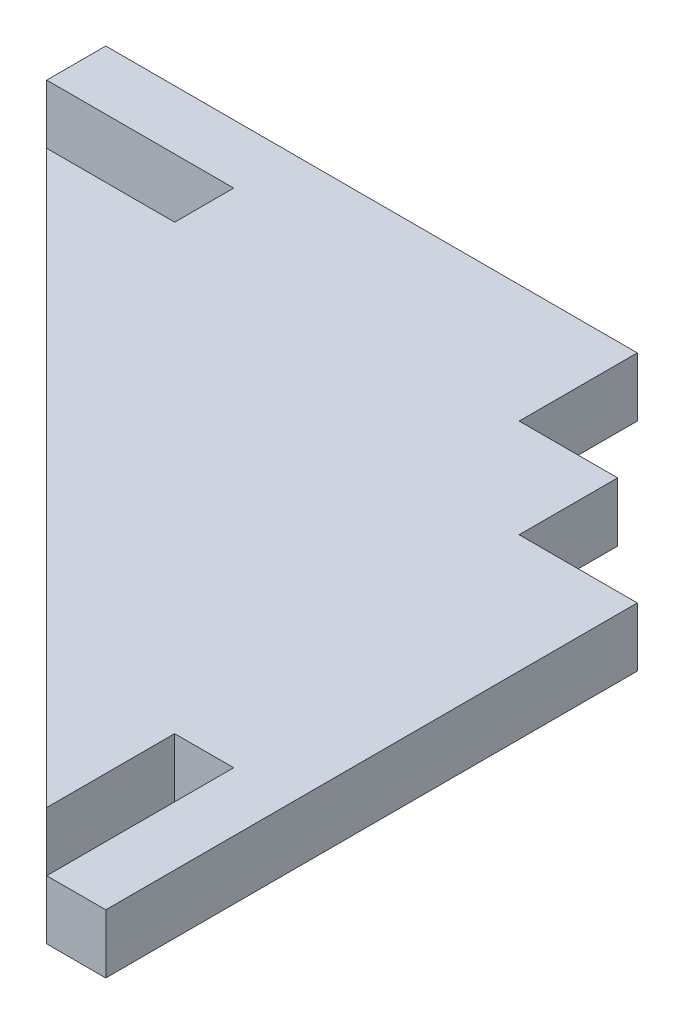
ISO-10303-21;
HEADER;
FILE_DESCRIPTION(('STEP AP214'),'2;1');
FILE_NAME('part.step','',(''),(''),'','','');
FILE_SCHEMA(('AUTOMOTIVE_DESIGN { 1 0 10303 214 1 1 1 1 }'));
ENDSEC;
DATA;
#1=APPLICATION_CONTEXT('core data for automotive mechanical design processes');
#2=APPLICATION_PROTOCOL_DEFINITION('international standard','automotive_design',2000,#1);
#3=PRODUCT_CONTEXT('',#1,'mechanical');
#4=PRODUCT('Part','Part','',(#3));
#5=PRODUCT_RELATED_PRODUCT_CATEGORY('part','',(#4));
#6=PRODUCT_DEFINITION_FORMATION('','',#4);
#7=PRODUCT_DEFINITION_CONTEXT('part definition',#1,'design');
#8=PRODUCT_DEFINITION('design','',#6,#7);
#9=PRODUCT_DEFINITION_SHAPE('','',#8);
#10=(LENGTH_UNIT() NAMED_UNIT(*) SI_UNIT(.MILLI.,.METRE.));
#11=(NAMED_UNIT(*) PLANE_ANGLE_UNIT() SI_UNIT($,.RADIAN.));
#12=(NAMED_UNIT(*) SI_UNIT($,.STERADIAN.) SOLID_ANGLE_UNIT());
#13=UNCERTAINTY_MEASURE_WITH_UNIT(LENGTH_MEASURE(1.E-05),#10,'distance_accuracy_value','');
#14=(GEOMETRIC_REPRESENTATION_CONTEXT(3) GLOBAL_UNCERTAINTY_ASSIGNED_CONTEXT((#13)) GLOBAL_UNIT_ASSIGNED_CONTEXT((#10,
#11,#12)) REPRESENTATION_CONTEXT('',''));
#15=CARTESIAN_POINT('',(0.,0.,0.));
#16=DIRECTION('',(0.,0.,1.));
#17=DIRECTION('',(1.,0.,0.));
#18=AXIS2_PLACEMENT_3D('',#15,#16,#17);
#19=CARTESIAN_POINT('',(0.,6.,10.));
#20=DIRECTION('',(-1.,0.,0.));
#21=DIRECTION('',(0.,0.,1.));
#22=AXIS2_PLACEMENT_3D('',#19,#20,#21);
#23=PLANE('',#22);
#24=DIRECTION('',(0.,0.,-1.));
#25=VECTOR('',#24,1.);
#26=CARTESIAN_POINT('',(0.,0.,10.));
#27=LINE('',#26,#25);
#28=CARTESIAN_POINT('',(0.,0.,10.));
#29=VERTEX_POINT('',#28);
#30=CARTESIAN_POINT('',(0.,0.,0.));
#31=VERTEX_POINT('',#30);
#32=EDGE_CURVE('E222',#29,#31,#27,.T.);
#33=ORIENTED_EDGE('',*,*,#32,.T.);
#34=DIRECTION('',(0.,-1.,0.));
#35=VECTOR('',#34,1.);
#36=CARTESIAN_POINT('',(0.,6.,0.));
#37=LINE('',#36,#35);
#38=CARTESIAN_POINT('',(0.,6.,0.));
#39=VERTEX_POINT('',#38);
#40=EDGE_CURVE('E50',#39,#31,#37,.T.);
#41=ORIENTED_EDGE('',*,*,#40,.F.);
#42=DIRECTION('',(0.,0.,-1.));
#43=VECTOR('',#42,1.);
#44=CARTESIAN_POINT('',(0.,6.,10.));
#45=LINE('',#44,#43);
#46=CARTESIAN_POINT('',(0.,6.,10.));
#47=VERTEX_POINT('',#46);
#48=EDGE_CURVE('E195',#47,#39,#45,.T.);
#49=ORIENTED_EDGE('',*,*,#48,.F.);
#50=DIRECTION('',(0.,-1.,0.));
#51=VECTOR('',#50,1.);
#52=CARTESIAN_POINT('',(0.,6.,10.));
#53=LINE('',#52,#51);
#54=EDGE_CURVE('E196',#47,#29,#53,.T.);
#55=ORIENTED_EDGE('',*,*,#54,.T.);
#56=EDGE_LOOP('',(#33,#41,#49,#55));
#57=FACE_BOUND('',#56,.T.);
#58=ADVANCED_FACE('F42',(#57),#23,.F.);
#59=CARTESIAN_POINT('',(0.,6.,0.));
#60=DIRECTION('',(0.,0.,1.));
#61=DIRECTION('',(1.,0.,0.));
#62=AXIS2_PLACEMENT_3D('',#59,#60,#61);
#63=PLANE('',#62);
#64=DIRECTION('',(-1.,0.,0.));
#65=VECTOR('',#64,1.);
#66=CARTESIAN_POINT('',(0.,0.,0.));
#67=LINE('',#66,#65);
#68=CARTESIAN_POINT('',(-10.,0.,0.));
#69=VERTEX_POINT('',#68);
#70=EDGE_CURVE('E186',#31,#69,#67,.T.);
#71=ORIENTED_EDGE('',*,*,#70,.T.);
#72=DIRECTION('',(0.,-1.,0.));
#73=VECTOR('',#72,1.);
#74=CARTESIAN_POINT('',(-10.,6.,0.));
#75=LINE('',#74,#73);
#76=CARTESIAN_POINT('',(-10.,6.,0.));
#77=VERTEX_POINT('',#76);
#78=EDGE_CURVE('E207',#77,#69,#75,.T.);
#79=ORIENTED_EDGE('',*,*,#78,.F.);
#80=DIRECTION('',(-1.,0.,0.));
#81=VECTOR('',#80,1.);
#82=CARTESIAN_POINT('',(0.,6.,0.));
#83=LINE('',#82,#81);
#84=EDGE_CURVE('E217',#39,#77,#83,.T.);
#85=ORIENTED_EDGE('',*,*,#84,.F.);
#86=ORIENTED_EDGE('',*,*,#40,.T.);
#87=EDGE_LOOP('',(#71,#79,#85,#86));
#88=FACE_BOUND('',#87,.T.);
#89=ADVANCED_FACE('F215',(#88),#63,.F.);
#90=CARTESIAN_POINT('',(-10.,6.,0.));
#91=DIRECTION('',(-1.,0.,0.));
#92=DIRECTION('',(0.,0.,1.));
#93=AXIS2_PLACEMENT_3D('',#90,#91,#92);
#94=PLANE('',#93);
#95=DIRECTION('',(0.,0.,-1.));
#96=VECTOR('',#95,1.);
#97=CARTESIAN_POINT('',(-10.,0.,0.));
#98=LINE('',#97,#96);
#99=CARTESIAN_POINT('',(-10.,0.,-12.));
#100=VERTEX_POINT('',#99);
#101=EDGE_CURVE('E179',#69,#100,#98,.T.);
#102=ORIENTED_EDGE('',*,*,#101,.T.);
#103=DIRECTION('',(0.,-1.,0.));
#104=VECTOR('',#103,1.);
#105=CARTESIAN_POINT('',(-10.,6.,-12.));
#106=LINE('',#105,#104);
#107=CARTESIAN_POINT('',(-10.,6.,-12.));
#108=VERTEX_POINT('',#107);
#109=EDGE_CURVE('E176',#108,#100,#106,.T.);
#110=ORIENTED_EDGE('',*,*,#109,.F.);
#111=DIRECTION('',(0.,0.,-1.));
#112=VECTOR('',#111,1.);
#113=CARTESIAN_POINT('',(-10.,6.,0.));
#114=LINE('',#113,#112);
#115=EDGE_CURVE('E246',#77,#108,#114,.T.);
#116=ORIENTED_EDGE('',*,*,#115,.F.);
#117=ORIENTED_EDGE('',*,*,#78,.T.);
#118=EDGE_LOOP('',(#102,#110,#116,#117));
#119=FACE_BOUND('',#118,.T.);
#120=ADVANCED_FACE('F339',(#119),#94,.F.);
#121=CARTESIAN_POINT('',(-10.,6.,-12.));
#122=DIRECTION('',(0.,0.,1.));
#123=DIRECTION('',(1.,0.,0.));
#124=AXIS2_PLACEMENT_3D('',#121,#122,#123);
#125=PLANE('',#124);
#126=DIRECTION('',(-1.,0.,0.));
#127=VECTOR('',#126,1.);
#128=CARTESIAN_POINT('',(-10.,0.,-12.));
#129=LINE('',#128,#127);
#130=CARTESIAN_POINT('',(-64.,0.,-12.));
#131=VERTEX_POINT('',#130);
#132=EDGE_CURVE('E168',#100,#131,#129,.T.);
#133=ORIENTED_EDGE('',*,*,#132,.T.);
#134=DIRECTION('',(0.,1.,0.));
#135=VECTOR('',#134,1.);
#136=CARTESIAN_POINT('',(-64.,0.,-12.));
#137=LINE('',#136,#135);
#138=CARTESIAN_POINT('',(-64.,6.,-12.));
#139=VERTEX_POINT('',#138);
#140=EDGE_CURVE('E149',#131,#139,#137,.T.);
#141=ORIENTED_EDGE('',*,*,#140,.T.);
#142=DIRECTION('',(-1.,0.,0.));
#143=VECTOR('',#142,1.);
#144=CARTESIAN_POINT('',(-10.,6.,-12.));
#145=LINE('',#144,#143);
#146=EDGE_CURVE('E243',#108,#139,#145,.T.);
#147=ORIENTED_EDGE('',*,*,#146,.F.);
#148=ORIENTED_EDGE('',*,*,#109,.T.);
#149=EDGE_LOOP('',(#133,#141,#147,#148));
#150=FACE_BOUND('',#149,.T.);
#151=ADVANCED_FACE('F174',(#150),#125,.F.);
#152=CARTESIAN_POINT('',(-70.,6.,-12.));
#153=DIRECTION('',(0.707106781186547,0.,-0.707106781186547));
#154=DIRECTION('',(-0.707106781186548,0.,-0.707106781186548));
#155=AXIS2_PLACEMENT_3D('',#152,#153,#154);
#156=PLANE('',#155);
#157=DIRECTION('',(0.707106781186548,0.,0.707106781186548));
#158=VECTOR('',#157,1.);
#159=CARTESIAN_POINT('',(-70.,6.,-12.));
#160=LINE('',#159,#158);
#161=CARTESIAN_POINT('',(-58.,6.,0.));
#162=VERTEX_POINT('',#161);
#163=CARTESIAN_POINT('',(0.,6.,58.));
#164=VERTEX_POINT('',#163);
#165=EDGE_CURVE('E239',#162,#164,#160,.T.);
#166=ORIENTED_EDGE('',*,*,#165,.F.);
#167=DIRECTION('',(0.,-1.,0.));
#168=VECTOR('',#167,1.);
#169=CARTESIAN_POINT('',(-58.,6.,0.));
#170=LINE('',#169,#168);
#171=CARTESIAN_POINT('',(-58.,0.,0.));
#172=VERTEX_POINT('',#171);
#173=EDGE_CURVE('E226',#162,#172,#170,.T.);
#174=ORIENTED_EDGE('',*,*,#173,.T.);
#175=DIRECTION('',(0.707106781186548,0.,0.707106781186548));
#176=VECTOR('',#175,1.);
#177=CARTESIAN_POINT('',(-70.,0.,-12.));
#178=LINE('',#177,#176);
#179=CARTESIAN_POINT('',(0.,0.,58.));
#180=VERTEX_POINT('',#179);
#181=EDGE_CURVE('E178',#172,#180,#178,.T.);
#182=ORIENTED_EDGE('',*,*,#181,.T.);
#183=DIRECTION('',(0.,1.,0.));
#184=VECTOR('',#183,1.);
#185=CARTESIAN_POINT('',(0.,6.,58.));
#186=LINE('',#185,#184);
#187=EDGE_CURVE('E231',#180,#164,#186,.T.);
#188=ORIENTED_EDGE('',*,*,#187,.T.);
#189=EDGE_LOOP('',(#166,#174,#182,#188));
#190=FACE_BOUND('',#189,.T.);
#191=ADVANCED_FACE('F350',(#190),#156,.F.);
#192=CARTESIAN_POINT('',(12.,6.,70.));
#193=DIRECTION('',(-1.,0.,0.));
#194=DIRECTION('',(0.,0.,1.));
#195=AXIS2_PLACEMENT_3D('',#192,#193,#194);
#196=PLANE('',#195);
#197=DIRECTION('',(0.,0.,-1.));
#198=VECTOR('',#197,1.);
#199=CARTESIAN_POINT('',(12.,6.,70.));
#200=LINE('',#199,#198);
#201=CARTESIAN_POINT('',(12.,6.,64.));
#202=VERTEX_POINT('',#201);
#203=CARTESIAN_POINT('',(12.,6.,10.));
#204=VERTEX_POINT('',#203);
#205=EDGE_CURVE('E236',#202,#204,#200,.T.);
#206=ORIENTED_EDGE('',*,*,#205,.F.);
#207=DIRECTION('',(0.,1.,0.));
#208=VECTOR('',#207,1.);
#209=CARTESIAN_POINT('',(12.,0.,64.));
#210=LINE('',#209,#208);
#211=CARTESIAN_POINT('',(12.,0.,64.));
#212=VERTEX_POINT('',#211);
#213=EDGE_CURVE('E315',#212,#202,#210,.T.);
#214=ORIENTED_EDGE('',*,*,#213,.F.);
#215=DIRECTION('',(0.,0.,-1.));
#216=VECTOR('',#215,1.);
#217=CARTESIAN_POINT('',(12.,0.,70.));
#218=LINE('',#217,#216);
#219=CARTESIAN_POINT('',(12.,0.,10.));
#220=VERTEX_POINT('',#219);
#221=EDGE_CURVE('E184',#212,#220,#218,.T.);
#222=ORIENTED_EDGE('',*,*,#221,.T.);
#223=DIRECTION('',(0.,-1.,0.));
#224=VECTOR('',#223,1.);
#225=CARTESIAN_POINT('',(12.,6.,10.));
#226=LINE('',#225,#224);
#227=EDGE_CURVE('E200',#204,#220,#226,.T.);
#228=ORIENTED_EDGE('',*,*,#227,.F.);
#229=EDGE_LOOP('',(#206,#214,#222,#228));
#230=FACE_BOUND('',#229,.T.);
#231=ADVANCED_FACE('F333',(#230),#196,.F.);
#232=CARTESIAN_POINT('',(12.,6.,10.));
#233=DIRECTION('',(0.,0.,1.));
#234=DIRECTION('',(1.,0.,0.));
#235=AXIS2_PLACEMENT_3D('',#232,#233,#234);
#236=PLANE('',#235);
#237=DIRECTION('',(-1.,0.,0.));
#238=VECTOR('',#237,1.);
#239=CARTESIAN_POINT('',(12.,0.,10.));
#240=LINE('',#239,#238);
#241=EDGE_CURVE('E192',#220,#29,#240,.T.);
#242=ORIENTED_EDGE('',*,*,#241,.T.);
#243=ORIENTED_EDGE('',*,*,#54,.F.);
#244=DIRECTION('',(-1.,0.,0.));
#245=VECTOR('',#244,1.);
#246=CARTESIAN_POINT('',(12.,6.,10.));
#247=LINE('',#246,#245);
#248=EDGE_CURVE('E201',#204,#47,#247,.T.);
#249=ORIENTED_EDGE('',*,*,#248,.F.);
#250=ORIENTED_EDGE('',*,*,#227,.T.);
#251=EDGE_LOOP('',(#242,#243,#249,#250));
#252=FACE_BOUND('',#251,.T.);
#253=ADVANCED_FACE('F336',(#252),#236,.F.);
#254=CARTESIAN_POINT('',(0.,6.,0.));
#255=DIRECTION('',(0.,1.,0.));
#256=DIRECTION('',(0.,0.,1.));
#257=AXIS2_PLACEMENT_3D('',#254,#255,#256);
#258=PLANE('',#257);
#259=DIRECTION('',(0.,0.,-1.));
#260=VECTOR('',#259,1.);
#261=CARTESIAN_POINT('',(-64.,6.,-6.));
#262=LINE('',#261,#260);
#263=CARTESIAN_POINT('',(-64.,6.,-6.));
#264=VERTEX_POINT('',#263);
#265=EDGE_CURVE('E155',#264,#139,#262,.T.);
#266=ORIENTED_EDGE('',*,*,#265,.F.);
#267=DIRECTION('',(-1.,0.,0.));
#268=VECTOR('',#267,1.);
#269=CARTESIAN_POINT('',(-64.,6.,-6.));
#270=LINE('',#269,#268);
#271=CARTESIAN_POINT('',(-45.,6.,-6.));
#272=VERTEX_POINT('',#271);
#273=EDGE_CURVE('E296',#272,#264,#270,.T.);
#274=ORIENTED_EDGE('',*,*,#273,.F.);
#275=DIRECTION('',(0.,0.,-1.));
#276=VECTOR('',#275,1.);
#277=CARTESIAN_POINT('',(-45.,6.,-6.));
#278=LINE('',#277,#276);
#279=CARTESIAN_POINT('',(-45.,6.,0.));
#280=VERTEX_POINT('',#279);
#281=EDGE_CURVE('E300',#280,#272,#278,.T.);
#282=ORIENTED_EDGE('',*,*,#281,.F.);
#283=DIRECTION('',(1.,0.,0.));
#284=VECTOR('',#283,1.);
#285=CARTESIAN_POINT('',(-64.,6.,0.));
#286=LINE('',#285,#284);
#287=EDGE_CURVE('E273',#162,#280,#286,.T.);
#288=ORIENTED_EDGE('',*,*,#287,.F.);
#289=ORIENTED_EDGE('',*,*,#165,.T.);
#290=DIRECTION('',(0.,0.,1.));
#291=VECTOR('',#290,1.);
#292=CARTESIAN_POINT('',(0.,6.,64.));
#293=LINE('',#292,#291);
#294=CARTESIAN_POINT('',(0.,6.,45.));
#295=VERTEX_POINT('',#294);
#296=EDGE_CURVE('E261',#295,#164,#293,.T.);
#297=ORIENTED_EDGE('',*,*,#296,.F.);
#298=DIRECTION('',(-1.,0.,0.));
#299=VECTOR('',#298,1.);
#300=CARTESIAN_POINT('',(6.,6.,45.));
#301=LINE('',#300,#299);
#302=CARTESIAN_POINT('',(6.,6.,45.));
#303=VERTEX_POINT('',#302);
#304=EDGE_CURVE('E274',#303,#295,#301,.T.);
#305=ORIENTED_EDGE('',*,*,#304,.F.);
#306=DIRECTION('',(0.,0.,-1.));
#307=VECTOR('',#306,1.);
#308=CARTESIAN_POINT('',(6.,6.,64.));
#309=LINE('',#308,#307);
#310=CARTESIAN_POINT('',(6.,6.,64.));
#311=VERTEX_POINT('',#310);
#312=EDGE_CURVE('E269',#311,#303,#309,.T.);
#313=ORIENTED_EDGE('',*,*,#312,.F.);
#314=DIRECTION('',(-1.,0.,0.));
#315=VECTOR('',#314,1.);
#316=CARTESIAN_POINT('',(6.,6.,64.));
#317=LINE('',#316,#315);
#318=EDGE_CURVE('E314',#202,#311,#317,.T.);
#319=ORIENTED_EDGE('',*,*,#318,.F.);
#320=ORIENTED_EDGE('',*,*,#205,.T.);
#321=ORIENTED_EDGE('',*,*,#248,.T.);
#322=ORIENTED_EDGE('',*,*,#48,.T.);
#323=ORIENTED_EDGE('',*,*,#84,.T.);
#324=ORIENTED_EDGE('',*,*,#115,.T.);
#325=ORIENTED_EDGE('',*,*,#146,.T.);
#326=EDGE_LOOP('',(#266,#274,#282,#288,#289,#297,#305,#313,#319,#320,#321,#322,#323,#324,#325));
#327=FACE_BOUND('',#326,.T.);
#328=ADVANCED_FACE('F330',(#327),#258,.T.);
#329=CARTESIAN_POINT('',(0.,0.,0.));
#330=DIRECTION('',(0.,1.,0.));
#331=DIRECTION('',(0.,0.,1.));
#332=AXIS2_PLACEMENT_3D('',#329,#330,#331);
#333=PLANE('',#332);
#334=DIRECTION('',(-1.,0.,0.));
#335=VECTOR('',#334,1.);
#336=CARTESIAN_POINT('',(-64.,0.,-6.));
#337=LINE('',#336,#335);
#338=CARTESIAN_POINT('',(-45.,0.,-6.));
#339=VERTEX_POINT('',#338);
#340=CARTESIAN_POINT('',(-64.,0.,-6.));
#341=VERTEX_POINT('',#340);
#342=EDGE_CURVE('E170',#339,#341,#337,.T.);
#343=ORIENTED_EDGE('',*,*,#342,.T.);
#344=DIRECTION('',(0.,0.,-1.));
#345=VECTOR('',#344,1.);
#346=CARTESIAN_POINT('',(-64.,0.,-6.));
#347=LINE('',#346,#345);
#348=EDGE_CURVE('E152',#341,#131,#347,.T.);
#349=ORIENTED_EDGE('',*,*,#348,.T.);
#350=ORIENTED_EDGE('',*,*,#132,.F.);
#351=ORIENTED_EDGE('',*,*,#101,.F.);
#352=ORIENTED_EDGE('',*,*,#70,.F.);
#353=ORIENTED_EDGE('',*,*,#32,.F.);
#354=ORIENTED_EDGE('',*,*,#241,.F.);
#355=ORIENTED_EDGE('',*,*,#221,.F.);
#356=DIRECTION('',(-1.,0.,0.));
#357=VECTOR('',#356,1.);
#358=CARTESIAN_POINT('',(6.,0.,64.));
#359=LINE('',#358,#357);
#360=CARTESIAN_POINT('',(6.,0.,64.));
#361=VERTEX_POINT('',#360);
#362=EDGE_CURVE('E310',#212,#361,#359,.T.);
#363=ORIENTED_EDGE('',*,*,#362,.T.);
#364=DIRECTION('',(0.,0.,-1.));
#365=VECTOR('',#364,1.);
#366=CARTESIAN_POINT('',(6.,0.,64.));
#367=LINE('',#366,#365);
#368=CARTESIAN_POINT('',(6.,0.,45.));
#369=VERTEX_POINT('',#368);
#370=EDGE_CURVE('E257',#361,#369,#367,.T.);
#371=ORIENTED_EDGE('',*,*,#370,.T.);
#372=DIRECTION('',(-1.,0.,0.));
#373=VECTOR('',#372,1.);
#374=CARTESIAN_POINT('',(6.,0.,45.));
#375=LINE('',#374,#373);
#376=CARTESIAN_POINT('',(0.,0.,45.));
#377=VERTEX_POINT('',#376);
#378=EDGE_CURVE('E262',#369,#377,#375,.T.);
#379=ORIENTED_EDGE('',*,*,#378,.T.);
#380=DIRECTION('',(0.,0.,1.));
#381=VECTOR('',#380,1.);
#382=CARTESIAN_POINT('',(0.,0.,64.));
#383=LINE('',#382,#381);
#384=EDGE_CURVE('E65',#377,#180,#383,.T.);
#385=ORIENTED_EDGE('',*,*,#384,.T.);
#386=ORIENTED_EDGE('',*,*,#181,.F.);
#387=DIRECTION('',(1.,0.,0.));
#388=VECTOR('',#387,1.);
#389=CARTESIAN_POINT('',(0.,0.,0.));
#390=LINE('',#389,#388);
#391=CARTESIAN_POINT('',(-45.,0.,0.));
#392=VERTEX_POINT('',#391);
#393=EDGE_CURVE('E11',#172,#392,#390,.T.);
#394=ORIENTED_EDGE('',*,*,#393,.T.);
#395=DIRECTION('',(0.,0.,-1.));
#396=VECTOR('',#395,1.);
#397=CARTESIAN_POINT('',(-45.,0.,-6.));
#398=LINE('',#397,#396);
#399=EDGE_CURVE('E57',#392,#339,#398,.T.);
#400=ORIENTED_EDGE('',*,*,#399,.T.);
#401=EDGE_LOOP('',(#343,#349,#350,#351,#352,#353,#354,#355,#363,#371,#379,#385,#386,#394,#400));
#402=FACE_BOUND('',#401,.T.);
#403=ADVANCED_FACE('F166',(#402),#333,.F.);
#404=CARTESIAN_POINT('',(0.,0.,64.));
#405=DIRECTION('',(-1.,0.,0.));
#406=DIRECTION('',(0.,0.,1.));
#407=AXIS2_PLACEMENT_3D('',#404,#405,#406);
#408=PLANE('',#407);
#409=ORIENTED_EDGE('',*,*,#384,.F.);
#410=DIRECTION('',(0.,1.,0.));
#411=VECTOR('',#410,1.);
#412=CARTESIAN_POINT('',(0.,0.,45.));
#413=LINE('',#412,#411);
#414=EDGE_CURVE('E283',#377,#295,#413,.T.);
#415=ORIENTED_EDGE('',*,*,#414,.T.);
#416=ORIENTED_EDGE('',*,*,#296,.T.);
#417=ORIENTED_EDGE('',*,*,#187,.F.);
#418=EDGE_LOOP('',(#409,#415,#416,#417));
#419=FACE_BOUND('',#418,.T.);
#420=ADVANCED_FACE('F352',(#419),#408,.F.);
#421=CARTESIAN_POINT('',(6.,0.,64.));
#422=DIRECTION('',(1.,0.,0.));
#423=DIRECTION('',(0.,0.,-1.));
#424=AXIS2_PLACEMENT_3D('',#421,#422,#423);
#425=PLANE('',#424);
#426=ORIENTED_EDGE('',*,*,#312,.T.);
#427=DIRECTION('',(0.,1.,0.));
#428=VECTOR('',#427,1.);
#429=CARTESIAN_POINT('',(6.,0.,45.));
#430=LINE('',#429,#428);
#431=EDGE_CURVE('E268',#369,#303,#430,.T.);
#432=ORIENTED_EDGE('',*,*,#431,.F.);
#433=ORIENTED_EDGE('',*,*,#370,.F.);
#434=DIRECTION('',(0.,1.,0.));
#435=VECTOR('',#434,1.);
#436=CARTESIAN_POINT('',(6.,0.,64.));
#437=LINE('',#436,#435);
#438=EDGE_CURVE('E161',#361,#311,#437,.T.);
#439=ORIENTED_EDGE('',*,*,#438,.T.);
#440=EDGE_LOOP('',(#426,#432,#433,#439));
#441=FACE_BOUND('',#440,.T.);
#442=ADVANCED_FACE('F358',(#441),#425,.F.);
#443=CARTESIAN_POINT('',(6.,0.,45.));
#444=DIRECTION('',(0.,0.,-1.));
#445=DIRECTION('',(-1.,0.,0.));
#446=AXIS2_PLACEMENT_3D('',#443,#444,#445);
#447=PLANE('',#446);
#448=ORIENTED_EDGE('',*,*,#304,.T.);
#449=ORIENTED_EDGE('',*,*,#414,.F.);
#450=ORIENTED_EDGE('',*,*,#378,.F.);
#451=ORIENTED_EDGE('',*,*,#431,.T.);
#452=EDGE_LOOP('',(#448,#449,#450,#451));
#453=FACE_BOUND('',#452,.T.);
#454=ADVANCED_FACE('F356',(#453),#447,.F.);
#455=CARTESIAN_POINT('',(-64.,0.,0.));
#456=DIRECTION('',(0.,0.,1.));
#457=DIRECTION('',(1.,0.,0.));
#458=AXIS2_PLACEMENT_3D('',#455,#456,#457);
#459=PLANE('',#458);
#460=ORIENTED_EDGE('',*,*,#287,.T.);
#461=DIRECTION('',(0.,1.,0.));
#462=VECTOR('',#461,1.);
#463=CARTESIAN_POINT('',(-45.,0.,0.));
#464=LINE('',#463,#462);
#465=EDGE_CURVE('E288',#392,#280,#464,.T.);
#466=ORIENTED_EDGE('',*,*,#465,.F.);
#467=ORIENTED_EDGE('',*,*,#393,.F.);
#468=ORIENTED_EDGE('',*,*,#173,.F.);
#469=EDGE_LOOP('',(#460,#466,#467,#468));
#470=FACE_BOUND('',#469,.T.);
#471=ADVANCED_FACE('F366',(#470),#459,.F.);
#472=CARTESIAN_POINT('',(-64.,0.,-6.));
#473=DIRECTION('',(0.,0.,-1.));
#474=DIRECTION('',(-1.,0.,0.));
#475=AXIS2_PLACEMENT_3D('',#472,#473,#474);
#476=PLANE('',#475);
#477=ORIENTED_EDGE('',*,*,#273,.T.);
#478=DIRECTION('',(0.,1.,0.));
#479=VECTOR('',#478,1.);
#480=CARTESIAN_POINT('',(-64.,0.,-6.));
#481=LINE('',#480,#479);
#482=EDGE_CURVE('E256',#341,#264,#481,.T.);
#483=ORIENTED_EDGE('',*,*,#482,.F.);
#484=ORIENTED_EDGE('',*,*,#342,.F.);
#485=DIRECTION('',(0.,1.,0.));
#486=VECTOR('',#485,1.);
#487=CARTESIAN_POINT('',(-45.,0.,-6.));
#488=LINE('',#487,#486);
#489=EDGE_CURVE('E291',#339,#272,#488,.T.);
#490=ORIENTED_EDGE('',*,*,#489,.T.);
#491=EDGE_LOOP('',(#477,#483,#484,#490));
#492=FACE_BOUND('',#491,.T.);
#493=ADVANCED_FACE('F343',(#492),#476,.F.);
#494=CARTESIAN_POINT('',(-45.,0.,-6.));
#495=DIRECTION('',(1.,0.,0.));
#496=DIRECTION('',(0.,0.,-1.));
#497=AXIS2_PLACEMENT_3D('',#494,#495,#496);
#498=PLANE('',#497);
#499=ORIENTED_EDGE('',*,*,#281,.T.);
#500=ORIENTED_EDGE('',*,*,#489,.F.);
#501=ORIENTED_EDGE('',*,*,#399,.F.);
#502=ORIENTED_EDGE('',*,*,#465,.T.);
#503=EDGE_LOOP('',(#499,#500,#501,#502));
#504=FACE_BOUND('',#503,.T.);
#505=ADVANCED_FACE('F344',(#504),#498,.F.);
#506=CARTESIAN_POINT('',(-64.,0.,-6.));
#507=DIRECTION('',(1.,0.,0.));
#508=DIRECTION('',(0.,0.,-1.));
#509=AXIS2_PLACEMENT_3D('',#506,#507,#508);
#510=PLANE('',#509);
#511=ORIENTED_EDGE('',*,*,#265,.T.);
#512=ORIENTED_EDGE('',*,*,#140,.F.);
#513=ORIENTED_EDGE('',*,*,#348,.F.);
#514=ORIENTED_EDGE('',*,*,#482,.T.);
#515=EDGE_LOOP('',(#511,#512,#513,#514));
#516=FACE_BOUND('',#515,.T.);
#517=ADVANCED_FACE('F151',(#516),#510,.F.);
#518=CARTESIAN_POINT('',(6.,0.,64.));
#519=DIRECTION('',(0.,0.,-1.));
#520=DIRECTION('',(-1.,0.,0.));
#521=AXIS2_PLACEMENT_3D('',#518,#519,#520);
#522=PLANE('',#521);
#523=ORIENTED_EDGE('',*,*,#318,.T.);
#524=ORIENTED_EDGE('',*,*,#438,.F.);
#525=ORIENTED_EDGE('',*,*,#362,.F.);
#526=ORIENTED_EDGE('',*,*,#213,.T.);
#527=EDGE_LOOP('',(#523,#524,#525,#526));
#528=FACE_BOUND('',#527,.T.);
#529=ADVANCED_FACE('F324',(#528),#522,.F.);
#530=CLOSED_SHELL('',(#58,#89,#120,#151,#191,#231,#253,#328,#403,#420,#442,#454,#471,#493,#505,
#517,#529));
#531=MANIFOLD_SOLID_BREP('B2',#530);
#532=ADVANCED_BREP_SHAPE_REPRESENTATION('',(#18,#531),#14);
#533=SHAPE_DEFINITION_REPRESENTATION(#9,#532);
ENDSEC;
END-ISO-10303-21;
